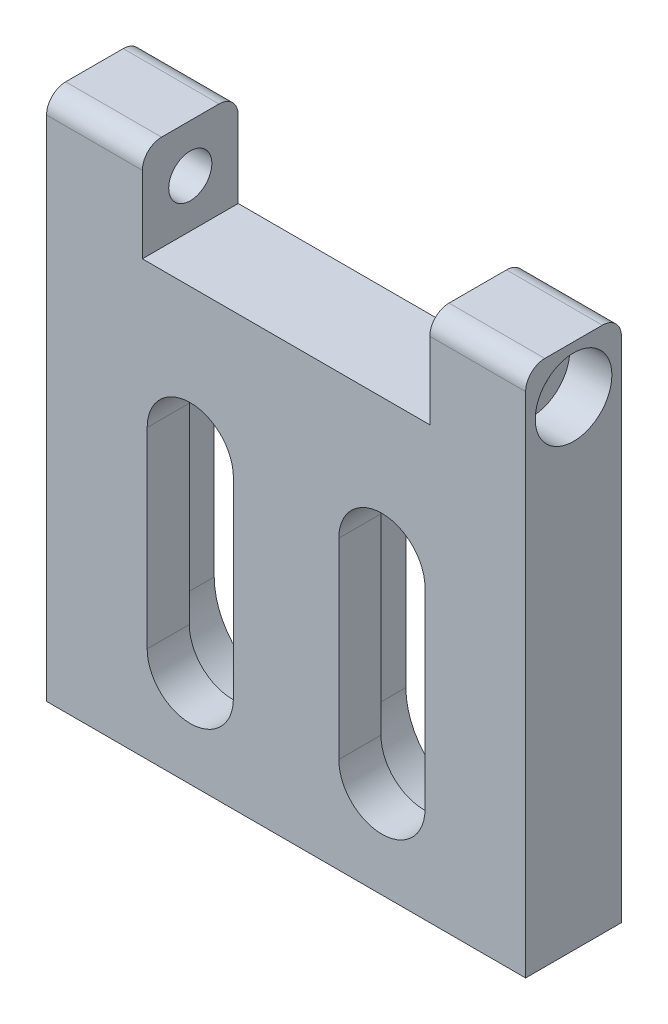
ISO-10303-21;
HEADER;
FILE_DESCRIPTION(('STEP AP214'),'2;1');
FILE_NAME('part.step','',(''),(''),'','','');
FILE_SCHEMA(('AUTOMOTIVE_DESIGN { 1 0 10303 214 1 1 1 1 }'));
ENDSEC;
DATA;
#1=APPLICATION_CONTEXT('core data for automotive mechanical design processes');
#2=APPLICATION_PROTOCOL_DEFINITION('international standard','automotive_design',2000,#1);
#3=PRODUCT_CONTEXT('',#1,'mechanical');
#4=PRODUCT('Part','Part','',(#3));
#5=PRODUCT_RELATED_PRODUCT_CATEGORY('part','',(#4));
#6=PRODUCT_DEFINITION_FORMATION('','',#4);
#7=PRODUCT_DEFINITION_CONTEXT('part definition',#1,'design');
#8=PRODUCT_DEFINITION('design','',#6,#7);
#9=PRODUCT_DEFINITION_SHAPE('','',#8);
#10=(LENGTH_UNIT() NAMED_UNIT(*) SI_UNIT(.MILLI.,.METRE.));
#11=(NAMED_UNIT(*) PLANE_ANGLE_UNIT() SI_UNIT($,.RADIAN.));
#12=(NAMED_UNIT(*) SI_UNIT($,.STERADIAN.) SOLID_ANGLE_UNIT());
#13=UNCERTAINTY_MEASURE_WITH_UNIT(LENGTH_MEASURE(1.E-05),#10,'distance_accuracy_value','');
#14=(GEOMETRIC_REPRESENTATION_CONTEXT(3) GLOBAL_UNCERTAINTY_ASSIGNED_CONTEXT((#13)) GLOBAL_UNIT_ASSIGNED_CONTEXT((#10,
#11,#12)) REPRESENTATION_CONTEXT('',''));
#15=CARTESIAN_POINT('',(0.,0.,0.));
#16=DIRECTION('',(0.,0.,1.));
#17=DIRECTION('',(1.,0.,0.));
#18=AXIS2_PLACEMENT_3D('',#15,#16,#17);
#19=CARTESIAN_POINT('',(10.,2.5,10.));
#20=DIRECTION('',(0.,0.,-1.));
#21=DIRECTION('',(-1.,0.,0.));
#22=AXIS2_PLACEMENT_3D('',#19,#20,#21);
#23=CYLINDRICAL_SURFACE('',#22,4.49999999999997);
#24=DIRECTION('',(0.,0.,-1.));
#25=VECTOR('',#24,1.);
#26=CARTESIAN_POINT('',(5.50000000000003,2.50000000000001,10.));
#27=LINE('',#26,#25);
#28=CARTESIAN_POINT('',(5.50000000000003,2.50000000000001,10.));
#29=VERTEX_POINT('',#28);
#30=CARTESIAN_POINT('',(5.50000000000003,2.50000000000001,5.6));
#31=VERTEX_POINT('',#30);
#32=EDGE_CURVE('E432',#29,#31,#27,.T.);
#33=ORIENTED_EDGE('',*,*,#32,.T.);
#34=CARTESIAN_POINT('',(10.,2.5,5.6));
#35=DIRECTION('',(0.,0.,-1.));
#36=DIRECTION('',(-1.,0.,0.));
#37=AXIS2_PLACEMENT_3D('',#34,#35,#36);
#38=CIRCLE('',#37,4.49999999999997);
#39=CARTESIAN_POINT('',(14.5,2.50000000000001,5.6));
#40=VERTEX_POINT('',#39);
#41=EDGE_CURVE('E331',#31,#40,#38,.T.);
#42=ORIENTED_EDGE('',*,*,#41,.T.);
#43=DIRECTION('',(0.,0.,-1.));
#44=VECTOR('',#43,1.);
#45=CARTESIAN_POINT('',(14.5,2.50000000000001,10.));
#46=LINE('',#45,#44);
#47=CARTESIAN_POINT('',(14.5,2.50000000000001,10.));
#48=VERTEX_POINT('',#47);
#49=EDGE_CURVE('E420',#48,#40,#46,.T.);
#50=ORIENTED_EDGE('',*,*,#49,.F.);
#51=CARTESIAN_POINT('',(10.,2.5,10.));
#52=DIRECTION('',(0.,0.,1.));
#53=DIRECTION('',(-1.,0.,0.));
#54=AXIS2_PLACEMENT_3D('',#51,#52,#53);
#55=CIRCLE('',#54,4.49999999999997);
#56=EDGE_CURVE('E397',#48,#29,#55,.T.);
#57=ORIENTED_EDGE('',*,*,#56,.T.);
#58=EDGE_LOOP('',(#33,#42,#50,#57));
#59=FACE_BOUND('',#58,.T.);
#60=ADVANCED_FACE('F38',(#59),#23,.F.);
#61=CARTESIAN_POINT('',(5.50000000000003,2.50000000000001,10.));
#62=DIRECTION('',(1.,0.,0.));
#63=DIRECTION('',(0.,1.,0.));
#64=AXIS2_PLACEMENT_3D('',#61,#62,#63);
#65=PLANE('',#64);
#66=DIRECTION('',(0.,0.,-1.));
#67=VECTOR('',#66,1.);
#68=CARTESIAN_POINT('',(5.50000000000004,-17.5,10.));
#69=LINE('',#68,#67);
#70=CARTESIAN_POINT('',(5.50000000000004,-17.5,10.));
#71=VERTEX_POINT('',#70);
#72=CARTESIAN_POINT('',(5.50000000000005,-17.5,5.6));
#73=VERTEX_POINT('',#72);
#74=EDGE_CURVE('E428',#71,#73,#69,.T.);
#75=ORIENTED_EDGE('',*,*,#74,.T.);
#76=DIRECTION('',(0.,1.,0.));
#77=VECTOR('',#76,1.);
#78=CARTESIAN_POINT('',(5.50000000000003,2.50000000000001,5.6));
#79=LINE('',#78,#77);
#80=EDGE_CURVE('E327',#73,#31,#79,.T.);
#81=ORIENTED_EDGE('',*,*,#80,.T.);
#82=ORIENTED_EDGE('',*,*,#32,.F.);
#83=DIRECTION('',(0.,-1.,0.));
#84=VECTOR('',#83,1.);
#85=CARTESIAN_POINT('',(5.50000000000003,2.50000000000001,10.));
#86=LINE('',#85,#84);
#87=EDGE_CURVE('E410',#29,#71,#86,.T.);
#88=ORIENTED_EDGE('',*,*,#87,.T.);
#89=EDGE_LOOP('',(#75,#81,#82,#88));
#90=FACE_BOUND('',#89,.T.);
#91=ADVANCED_FACE('F624',(#90),#65,.T.);
#92=CARTESIAN_POINT('',(10.,-17.5,10.));
#93=DIRECTION('',(0.,0.,-1.));
#94=DIRECTION('',(-1.,0.,0.));
#95=AXIS2_PLACEMENT_3D('',#92,#93,#94);
#96=CYLINDRICAL_SURFACE('',#95,4.49999999999997);
#97=DIRECTION('',(0.,0.,-1.));
#98=VECTOR('',#97,1.);
#99=CARTESIAN_POINT('',(14.5,-17.5,10.));
#100=LINE('',#99,#98);
#101=CARTESIAN_POINT('',(14.5,-17.5,10.));
#102=VERTEX_POINT('',#101);
#103=CARTESIAN_POINT('',(14.5,-17.5,5.6));
#104=VERTEX_POINT('',#103);
#105=EDGE_CURVE('E424',#102,#104,#100,.T.);
#106=ORIENTED_EDGE('',*,*,#105,.T.);
#107=CARTESIAN_POINT('',(10.,-17.5,5.6));
#108=DIRECTION('',(0.,0.,-1.));
#109=DIRECTION('',(-1.,0.,0.));
#110=AXIS2_PLACEMENT_3D('',#107,#108,#109);
#111=CIRCLE('',#110,4.49999999999997);
#112=EDGE_CURVE('E275',#104,#73,#111,.T.);
#113=ORIENTED_EDGE('',*,*,#112,.T.);
#114=ORIENTED_EDGE('',*,*,#74,.F.);
#115=CARTESIAN_POINT('',(10.,-17.5,10.));
#116=DIRECTION('',(0.,0.,1.));
#117=DIRECTION('',(-1.,0.,0.));
#118=AXIS2_PLACEMENT_3D('',#115,#116,#117);
#119=CIRCLE('',#118,4.49999999999997);
#120=EDGE_CURVE('E413',#71,#102,#119,.T.);
#121=ORIENTED_EDGE('',*,*,#120,.T.);
#122=EDGE_LOOP('',(#106,#113,#114,#121));
#123=FACE_BOUND('',#122,.T.);
#124=ADVANCED_FACE('F630',(#123),#96,.F.);
#125=CARTESIAN_POINT('',(14.5,2.50000000000001,10.));
#126=DIRECTION('',(-1.,0.,0.));
#127=DIRECTION('',(0.,-1.,0.));
#128=AXIS2_PLACEMENT_3D('',#125,#126,#127);
#129=PLANE('',#128);
#130=ORIENTED_EDGE('',*,*,#49,.T.);
#131=DIRECTION('',(0.,-1.,0.));
#132=VECTOR('',#131,1.);
#133=CARTESIAN_POINT('',(14.5,2.50000000000001,5.6));
#134=LINE('',#133,#132);
#135=EDGE_CURVE('E499',#40,#104,#134,.T.);
#136=ORIENTED_EDGE('',*,*,#135,.T.);
#137=ORIENTED_EDGE('',*,*,#105,.F.);
#138=DIRECTION('',(0.,1.,0.));
#139=VECTOR('',#138,1.);
#140=CARTESIAN_POINT('',(14.5,2.50000000000001,10.));
#141=LINE('',#140,#139);
#142=EDGE_CURVE('E417',#102,#48,#141,.T.);
#143=ORIENTED_EDGE('',*,*,#142,.T.);
#144=EDGE_LOOP('',(#130,#136,#137,#143));
#145=FACE_BOUND('',#144,.T.);
#146=ADVANCED_FACE('F725',(#145),#129,.T.);
#147=CARTESIAN_POINT('',(-25.,27.5,10.));
#148=DIRECTION('',(0.,-1.,0.));
#149=DIRECTION('',(0.,0.,-1.));
#150=AXIS2_PLACEMENT_3D('',#147,#148,#149);
#151=PLANE('',#150);
#152=DIRECTION('',(0.,0.,-1.));
#153=VECTOR('',#152,1.);
#154=CARTESIAN_POINT('',(25.,27.5,10.));
#155=LINE('',#154,#153);
#156=CARTESIAN_POINT('',(25.,27.5,8.));
#157=VERTEX_POINT('',#156);
#158=CARTESIAN_POINT('',(25.,27.5,2.));
#159=VERTEX_POINT('',#158);
#160=EDGE_CURVE('E496',#157,#159,#155,.T.);
#161=ORIENTED_EDGE('',*,*,#160,.T.);
#162=DIRECTION('',(-1.,0.,0.));
#163=VECTOR('',#162,1.);
#164=CARTESIAN_POINT('',(-25.,27.5,2.));
#165=LINE('',#164,#163);
#166=CARTESIAN_POINT('',(15.,27.5,2.));
#167=VERTEX_POINT('',#166);
#168=EDGE_CURVE('E547',#159,#167,#165,.T.);
#169=ORIENTED_EDGE('',*,*,#168,.T.);
#170=DIRECTION('',(0.,0.,-1.));
#171=VECTOR('',#170,1.);
#172=CARTESIAN_POINT('',(15.,27.5,10.));
#173=LINE('',#172,#171);
#174=CARTESIAN_POINT('',(15.,27.5,8.));
#175=VERTEX_POINT('',#174);
#176=EDGE_CURVE('E393',#175,#167,#173,.T.);
#177=ORIENTED_EDGE('',*,*,#176,.F.);
#178=DIRECTION('',(-1.,0.,0.));
#179=VECTOR('',#178,1.);
#180=CARTESIAN_POINT('',(25.,27.5,8.));
#181=LINE('',#180,#179);
#182=EDGE_CURVE('E59',#175,#157,#181,.F.);
#183=ORIENTED_EDGE('',*,*,#182,.T.);
#184=EDGE_LOOP('',(#161,#169,#177,#183));
#185=FACE_BOUND('',#184,.T.);
#186=ADVANCED_FACE('F572',(#185),#151,.F.);
#187=CARTESIAN_POINT('',(0.,0.,10.));
#188=DIRECTION('',(0.,0.,1.));
#189=DIRECTION('',(1.,0.,0.));
#190=AXIS2_PLACEMENT_3D('',#187,#188,#189);
#191=PLANE('',#190);
#192=DIRECTION('',(0.,1.,0.));
#193=VECTOR('',#192,1.);
#194=CARTESIAN_POINT('',(-15.,27.5,10.));
#195=LINE('',#194,#193);
#196=CARTESIAN_POINT('',(-15.,17.5,10.));
#197=VERTEX_POINT('',#196);
#198=CARTESIAN_POINT('',(-15.,25.5,10.));
#199=VERTEX_POINT('',#198);
#200=EDGE_CURVE('E378',#197,#199,#195,.T.);
#201=ORIENTED_EDGE('',*,*,#200,.T.);
#202=DIRECTION('',(-1.,0.,0.));
#203=VECTOR('',#202,1.);
#204=CARTESIAN_POINT('',(-25.,25.5,10.));
#205=LINE('',#204,#203);
#206=CARTESIAN_POINT('',(-25.,25.5,10.));
#207=VERTEX_POINT('',#206);
#208=EDGE_CURVE('E541',#199,#207,#205,.T.);
#209=ORIENTED_EDGE('',*,*,#208,.T.);
#210=DIRECTION('',(0.,-1.,0.));
#211=VECTOR('',#210,1.);
#212=CARTESIAN_POINT('',(-25.,27.5,10.));
#213=LINE('',#212,#211);
#214=CARTESIAN_POINT('',(-25.,-27.5,10.));
#215=VERTEX_POINT('',#214);
#216=EDGE_CURVE('E470',#207,#215,#213,.T.);
#217=ORIENTED_EDGE('',*,*,#216,.T.);
#218=DIRECTION('',(1.,0.,0.));
#219=VECTOR('',#218,1.);
#220=CARTESIAN_POINT('',(-25.,-27.5,10.));
#221=LINE('',#220,#219);
#222=CARTESIAN_POINT('',(25.,-27.5,10.));
#223=VERTEX_POINT('',#222);
#224=EDGE_CURVE('E474',#215,#223,#221,.T.);
#225=ORIENTED_EDGE('',*,*,#224,.T.);
#226=DIRECTION('',(0.,1.,0.));
#227=VECTOR('',#226,1.);
#228=CARTESIAN_POINT('',(25.,27.5,10.));
#229=LINE('',#228,#227);
#230=CARTESIAN_POINT('',(25.,25.5,10.));
#231=VERTEX_POINT('',#230);
#232=EDGE_CURVE('E466',#223,#231,#229,.T.);
#233=ORIENTED_EDGE('',*,*,#232,.T.);
#234=DIRECTION('',(-1.,0.,0.));
#235=VECTOR('',#234,1.);
#236=CARTESIAN_POINT('',(15.,25.5,10.));
#237=LINE('',#236,#235);
#238=CARTESIAN_POINT('',(15.,25.5,10.));
#239=VERTEX_POINT('',#238);
#240=EDGE_CURVE('E537',#231,#239,#237,.T.);
#241=ORIENTED_EDGE('',*,*,#240,.T.);
#242=DIRECTION('',(0.,-1.,0.));
#243=VECTOR('',#242,1.);
#244=CARTESIAN_POINT('',(15.,27.5,10.));
#245=LINE('',#244,#243);
#246=CARTESIAN_POINT('',(15.,17.5,10.));
#247=VERTEX_POINT('',#246);
#248=EDGE_CURVE('E370',#239,#247,#245,.T.);
#249=ORIENTED_EDGE('',*,*,#248,.T.);
#250=DIRECTION('',(-1.,0.,0.));
#251=VECTOR('',#250,1.);
#252=CARTESIAN_POINT('',(15.,17.5,10.));
#253=LINE('',#252,#251);
#254=EDGE_CURVE('E373',#247,#197,#253,.T.);
#255=ORIENTED_EDGE('',*,*,#254,.T.);
#256=EDGE_LOOP('',(#201,#209,#217,#225,#233,#241,#249,#255));
#257=FACE_BOUND('',#256,.T.);
#258=DIRECTION('',(0.,-1.,0.));
#259=VECTOR('',#258,1.);
#260=CARTESIAN_POINT('',(-14.5,2.5,10.));
#261=LINE('',#260,#259);
#262=CARTESIAN_POINT('',(-14.5,2.5,10.));
#263=VERTEX_POINT('',#262);
#264=CARTESIAN_POINT('',(-14.5,-17.5,10.));
#265=VERTEX_POINT('',#264);
#266=EDGE_CURVE('E439',#263,#265,#261,.T.);
#267=ORIENTED_EDGE('',*,*,#266,.F.);
#268=CARTESIAN_POINT('',(-10.,2.5,10.));
#269=DIRECTION('',(0.,0.,1.));
#270=DIRECTION('',(1.,0.,0.));
#271=AXIS2_PLACEMENT_3D('',#268,#269,#270);
#272=CIRCLE('',#271,4.49999999999997);
#273=CARTESIAN_POINT('',(-5.50000000000002,2.50000000000001,10.));
#274=VERTEX_POINT('',#273);
#275=EDGE_CURVE('E436',#274,#263,#272,.T.);
#276=ORIENTED_EDGE('',*,*,#275,.F.);
#277=DIRECTION('',(0.,1.,0.));
#278=VECTOR('',#277,1.);
#279=CARTESIAN_POINT('',(-5.50000000000002,2.50000000000001,10.));
#280=LINE('',#279,#278);
#281=CARTESIAN_POINT('',(-5.50000000000002,-17.5,10.));
#282=VERTEX_POINT('',#281);
#283=EDGE_CURVE('E446',#282,#274,#280,.T.);
#284=ORIENTED_EDGE('',*,*,#283,.F.);
#285=CARTESIAN_POINT('',(-9.99999999999999,-17.5,10.));
#286=DIRECTION('',(0.,0.,1.));
#287=DIRECTION('',(1.,0.,0.));
#288=AXIS2_PLACEMENT_3D('',#285,#286,#287);
#289=CIRCLE('',#288,4.49999999999997);
#290=EDGE_CURVE('E442',#265,#282,#289,.T.);
#291=ORIENTED_EDGE('',*,*,#290,.F.);
#292=EDGE_LOOP('',(#267,#276,#284,#291));
#293=FACE_BOUND('',#292,.T.);
#294=ORIENTED_EDGE('',*,*,#87,.F.);
#295=ORIENTED_EDGE('',*,*,#56,.F.);
#296=ORIENTED_EDGE('',*,*,#142,.F.);
#297=ORIENTED_EDGE('',*,*,#120,.F.);
#298=EDGE_LOOP('',(#294,#295,#296,#297));
#299=FACE_BOUND('',#298,.T.);
#300=ADVANCED_FACE('F564',(#257,#293,#299),#191,.T.);
#301=CARTESIAN_POINT('',(0.,0.,0.));
#302=DIRECTION('',(0.,0.,1.));
#303=DIRECTION('',(1.,0.,0.));
#304=AXIS2_PLACEMENT_3D('',#301,#302,#303);
#305=PLANE('',#304);
#306=DIRECTION('',(0.,-1.,0.));
#307=VECTOR('',#306,1.);
#308=CARTESIAN_POINT('',(17.5,2.5,0.));
#309=LINE('',#308,#307);
#310=CARTESIAN_POINT('',(17.5,2.5,0.));
#311=VERTEX_POINT('',#310);
#312=CARTESIAN_POINT('',(17.5,-17.5,0.));
#313=VERTEX_POINT('',#312);
#314=EDGE_CURVE('E265',#311,#313,#309,.T.);
#315=ORIENTED_EDGE('',*,*,#314,.F.);
#316=CARTESIAN_POINT('',(10.,2.50000000000001,0.));
#317=DIRECTION('',(0.,0.,-1.));
#318=DIRECTION('',(-1.,0.,0.));
#319=AXIS2_PLACEMENT_3D('',#316,#317,#318);
#320=CIRCLE('',#319,7.5);
#321=CARTESIAN_POINT('',(2.50000000000001,2.50000000000001,0.));
#322=VERTEX_POINT('',#321);
#323=EDGE_CURVE('E231',#322,#311,#320,.T.);
#324=ORIENTED_EDGE('',*,*,#323,.F.);
#325=DIRECTION('',(0.,1.,0.));
#326=VECTOR('',#325,1.);
#327=CARTESIAN_POINT('',(2.50000000000001,2.50000000000001,0.));
#328=LINE('',#327,#326);
#329=CARTESIAN_POINT('',(2.50000000000001,-17.5,0.));
#330=VERTEX_POINT('',#329);
#331=EDGE_CURVE('E251',#330,#322,#328,.T.);
#332=ORIENTED_EDGE('',*,*,#331,.F.);
#333=CARTESIAN_POINT('',(10.,-17.5,0.));
#334=DIRECTION('',(0.,0.,-1.));
#335=DIRECTION('',(-1.,0.,0.));
#336=AXIS2_PLACEMENT_3D('',#333,#334,#335);
#337=CIRCLE('',#336,7.5);
#338=EDGE_CURVE('E256',#313,#330,#337,.T.);
#339=ORIENTED_EDGE('',*,*,#338,.F.);
#340=EDGE_LOOP('',(#315,#324,#332,#339));
#341=FACE_BOUND('',#340,.T.);
#342=DIRECTION('',(0.,-1.,0.));
#343=VECTOR('',#342,1.);
#344=CARTESIAN_POINT('',(-2.50000000000001,2.50000000000001,0.));
#345=LINE('',#344,#343);
#346=CARTESIAN_POINT('',(-2.50000000000001,2.50000000000001,0.));
#347=VERTEX_POINT('',#346);
#348=CARTESIAN_POINT('',(-2.50000000000001,-17.5,0.));
#349=VERTEX_POINT('',#348);
#350=EDGE_CURVE('E302',#347,#349,#345,.T.);
#351=ORIENTED_EDGE('',*,*,#350,.F.);
#352=CARTESIAN_POINT('',(-10.,2.50000000000001,0.));
#353=DIRECTION('',(0.,0.,-1.));
#354=DIRECTION('',(1.,0.,0.));
#355=AXIS2_PLACEMENT_3D('',#352,#353,#354);
#356=CIRCLE('',#355,7.5);
#357=CARTESIAN_POINT('',(-17.5,2.5,0.));
#358=VERTEX_POINT('',#357);
#359=EDGE_CURVE('E299',#358,#347,#356,.T.);
#360=ORIENTED_EDGE('',*,*,#359,.F.);
#361=DIRECTION('',(0.,1.,0.));
#362=VECTOR('',#361,1.);
#363=CARTESIAN_POINT('',(-17.5,2.5,0.));
#364=LINE('',#363,#362);
#365=CARTESIAN_POINT('',(-17.5,-17.5,0.));
#366=VERTEX_POINT('',#365);
#367=EDGE_CURVE('E286',#366,#358,#364,.T.);
#368=ORIENTED_EDGE('',*,*,#367,.F.);
#369=CARTESIAN_POINT('',(-10.,-17.5,0.));
#370=DIRECTION('',(0.,0.,-1.));
#371=DIRECTION('',(1.,0.,0.));
#372=AXIS2_PLACEMENT_3D('',#369,#370,#371);
#373=CIRCLE('',#372,7.5);
#374=EDGE_CURVE('E306',#349,#366,#373,.T.);
#375=ORIENTED_EDGE('',*,*,#374,.F.);
#376=EDGE_LOOP('',(#351,#360,#368,#375));
#377=FACE_BOUND('',#376,.T.);
#378=DIRECTION('',(0.,-1.,0.));
#379=VECTOR('',#378,1.);
#380=CARTESIAN_POINT('',(-25.,27.5,0.));
#381=LINE('',#380,#379);
#382=CARTESIAN_POINT('',(-25.,25.5,0.));
#383=VERTEX_POINT('',#382);
#384=CARTESIAN_POINT('',(-25.,-27.5,0.));
#385=VERTEX_POINT('',#384);
#386=EDGE_CURVE('E480',#383,#385,#381,.T.);
#387=ORIENTED_EDGE('',*,*,#386,.F.);
#388=DIRECTION('',(-1.,0.,0.));
#389=VECTOR('',#388,1.);
#390=CARTESIAN_POINT('',(0.,25.5,0.));
#391=LINE('',#390,#389);
#392=CARTESIAN_POINT('',(-15.,25.5,0.));
#393=VERTEX_POINT('',#392);
#394=EDGE_CURVE('E528',#383,#393,#391,.F.);
#395=ORIENTED_EDGE('',*,*,#394,.T.);
#396=DIRECTION('',(0.,1.,0.));
#397=VECTOR('',#396,1.);
#398=CARTESIAN_POINT('',(-15.,27.5,0.));
#399=LINE('',#398,#397);
#400=CARTESIAN_POINT('',(-15.,17.5,0.));
#401=VERTEX_POINT('',#400);
#402=EDGE_CURVE('E374',#401,#393,#399,.T.);
#403=ORIENTED_EDGE('',*,*,#402,.F.);
#404=DIRECTION('',(-1.,0.,0.));
#405=VECTOR('',#404,1.);
#406=CARTESIAN_POINT('',(15.,17.5,0.));
#407=LINE('',#406,#405);
#408=CARTESIAN_POINT('',(15.,17.5,0.));
#409=VERTEX_POINT('',#408);
#410=EDGE_CURVE('E386',#409,#401,#407,.T.);
#411=ORIENTED_EDGE('',*,*,#410,.F.);
#412=DIRECTION('',(0.,-1.,0.));
#413=VECTOR('',#412,1.);
#414=CARTESIAN_POINT('',(15.,27.5,0.));
#415=LINE('',#414,#413);
#416=CARTESIAN_POINT('',(15.,25.5,0.));
#417=VERTEX_POINT('',#416);
#418=EDGE_CURVE('E383',#417,#409,#415,.T.);
#419=ORIENTED_EDGE('',*,*,#418,.F.);
#420=DIRECTION('',(-1.,0.,0.));
#421=VECTOR('',#420,1.);
#422=CARTESIAN_POINT('',(0.,25.5,0.));
#423=LINE('',#422,#421);
#424=CARTESIAN_POINT('',(25.,25.5,0.));
#425=VERTEX_POINT('',#424);
#426=EDGE_CURVE('E525',#417,#425,#423,.F.);
#427=ORIENTED_EDGE('',*,*,#426,.T.);
#428=DIRECTION('',(0.,1.,0.));
#429=VECTOR('',#428,1.);
#430=CARTESIAN_POINT('',(25.,27.5,0.));
#431=LINE('',#430,#429);
#432=CARTESIAN_POINT('',(25.,-27.5,0.));
#433=VERTEX_POINT('',#432);
#434=EDGE_CURVE('E465',#433,#425,#431,.T.);
#435=ORIENTED_EDGE('',*,*,#434,.F.);
#436=DIRECTION('',(1.,0.,0.));
#437=VECTOR('',#436,1.);
#438=CARTESIAN_POINT('',(-25.,-27.5,0.));
#439=LINE('',#438,#437);
#440=EDGE_CURVE('E471',#385,#433,#439,.T.);
#441=ORIENTED_EDGE('',*,*,#440,.F.);
#442=EDGE_LOOP('',(#387,#395,#403,#411,#419,#427,#435,#441));
#443=FACE_BOUND('',#442,.T.);
#444=ADVANCED_FACE('F581',(#341,#377,#443),#305,.F.);
#445=CARTESIAN_POINT('',(25.,27.5,10.));
#446=DIRECTION('',(-1.,0.,0.));
#447=DIRECTION('',(0.,-1.,0.));
#448=AXIS2_PLACEMENT_3D('',#445,#446,#447);
#449=PLANE('',#448);
#450=CARTESIAN_POINT('',(25.,22.5,5.));
#451=DIRECTION('',(1.,0.,0.));
#452=DIRECTION('',(0.,0.,-1.));
#453=AXIS2_PLACEMENT_3D('',#450,#451,#452);
#454=CIRCLE('',#453,3.99999999999999);
#455=CARTESIAN_POINT('',(25.,22.5,1.00000000000001));
#456=VERTEX_POINT('',#455);
#457=EDGE_CURVE('E357',#456,#456,#454,.T.);
#458=ORIENTED_EDGE('',*,*,#457,.F.);
#459=EDGE_LOOP('',(#458));
#460=FACE_BOUND('',#459,.T.);
#461=ORIENTED_EDGE('',*,*,#434,.T.);
#462=CARTESIAN_POINT('',(25.,25.5,2.));
#463=DIRECTION('',(-1.,0.,0.));
#464=DIRECTION('',(0.,-1.,0.));
#465=AXIS2_PLACEMENT_3D('',#462,#463,#464);
#466=CIRCLE('',#465,2.);
#467=EDGE_CURVE('E11',#425,#159,#466,.F.);
#468=ORIENTED_EDGE('',*,*,#467,.T.);
#469=ORIENTED_EDGE('',*,*,#160,.F.);
#470=CARTESIAN_POINT('',(25.,25.5,8.));
#471=DIRECTION('',(-1.,0.,0.));
#472=DIRECTION('',(0.,-1.,0.));
#473=AXIS2_PLACEMENT_3D('',#470,#471,#472);
#474=CIRCLE('',#473,2.);
#475=EDGE_CURVE('E47',#157,#231,#474,.F.);
#476=ORIENTED_EDGE('',*,*,#475,.T.);
#477=ORIENTED_EDGE('',*,*,#232,.F.);
#478=DIRECTION('',(0.,0.,-1.));
#479=VECTOR('',#478,1.);
#480=CARTESIAN_POINT('',(25.,-27.5,10.));
#481=LINE('',#480,#479);
#482=EDGE_CURVE('E477',#223,#433,#481,.T.);
#483=ORIENTED_EDGE('',*,*,#482,.T.);
#484=EDGE_LOOP('',(#461,#468,#469,#476,#477,#483));
#485=FACE_BOUND('',#484,.T.);
#486=ADVANCED_FACE('F560',(#460,#485),#449,.F.);
#487=DIRECTION('',(0.,0.,-1.));
#488=VECTOR('',#487,1.);
#489=CARTESIAN_POINT('',(-15.,27.5,10.));
#490=LINE('',#489,#488);
#491=CARTESIAN_POINT('',(-15.,27.5,8.));
#492=VERTEX_POINT('',#491);
#493=CARTESIAN_POINT('',(-15.,27.5,2.));
#494=VERTEX_POINT('',#493);
#495=EDGE_CURVE('E398',#492,#494,#490,.T.);
#496=ORIENTED_EDGE('',*,*,#495,.T.);
#497=DIRECTION('',(-1.,0.,0.));
#498=VECTOR('',#497,1.);
#499=CARTESIAN_POINT('',(-25.,27.5,2.));
#500=LINE('',#499,#498);
#501=CARTESIAN_POINT('',(-25.,27.5,2.));
#502=VERTEX_POINT('',#501);
#503=EDGE_CURVE('E515',#494,#502,#500,.T.);
#504=ORIENTED_EDGE('',*,*,#503,.T.);
#505=DIRECTION('',(0.,0.,-1.));
#506=VECTOR('',#505,1.);
#507=CARTESIAN_POINT('',(-25.,27.5,10.));
#508=LINE('',#507,#506);
#509=CARTESIAN_POINT('',(-25.,27.5,8.));
#510=VERTEX_POINT('',#509);
#511=EDGE_CURVE('E492',#510,#502,#508,.T.);
#512=ORIENTED_EDGE('',*,*,#511,.F.);
#513=DIRECTION('',(-1.,0.,0.));
#514=VECTOR('',#513,1.);
#515=CARTESIAN_POINT('',(-15.,27.5,8.));
#516=LINE('',#515,#514);
#517=EDGE_CURVE('E512',#510,#492,#516,.F.);
#518=ORIENTED_EDGE('',*,*,#517,.T.);
#519=EDGE_LOOP('',(#496,#504,#512,#518));
#520=FACE_BOUND('',#519,.T.);
#521=ADVANCED_FACE('F600',(#520),#151,.F.);
#522=CARTESIAN_POINT('',(-25.,27.5,10.));
#523=DIRECTION('',(1.,0.,0.));
#524=DIRECTION('',(0.,1.,0.));
#525=AXIS2_PLACEMENT_3D('',#522,#523,#524);
#526=PLANE('',#525);
#527=CARTESIAN_POINT('',(-25.,22.5,5.));
#528=DIRECTION('',(-1.,0.,0.));
#529=DIRECTION('',(0.,0.,1.));
#530=AXIS2_PLACEMENT_3D('',#527,#528,#529);
#531=CIRCLE('',#530,3.99999999999999);
#532=CARTESIAN_POINT('',(-25.,22.5,8.99999999999999));
#533=VERTEX_POINT('',#532);
#534=EDGE_CURVE('E344',#533,#533,#531,.T.);
#535=ORIENTED_EDGE('',*,*,#534,.F.);
#536=EDGE_LOOP('',(#535));
#537=FACE_BOUND('',#536,.T.);
#538=ORIENTED_EDGE('',*,*,#511,.T.);
#539=CARTESIAN_POINT('',(-25.,25.5,2.));
#540=DIRECTION('',(1.,0.,0.));
#541=DIRECTION('',(0.,1.,0.));
#542=AXIS2_PLACEMENT_3D('',#539,#540,#541);
#543=CIRCLE('',#542,2.);
#544=EDGE_CURVE('E522',#502,#383,#543,.F.);
#545=ORIENTED_EDGE('',*,*,#544,.T.);
#546=ORIENTED_EDGE('',*,*,#386,.T.);
#547=DIRECTION('',(0.,0.,-1.));
#548=VECTOR('',#547,1.);
#549=CARTESIAN_POINT('',(-25.,-27.5,10.));
#550=LINE('',#549,#548);
#551=EDGE_CURVE('E488',#215,#385,#550,.T.);
#552=ORIENTED_EDGE('',*,*,#551,.F.);
#553=ORIENTED_EDGE('',*,*,#216,.F.);
#554=CARTESIAN_POINT('',(-25.,25.5,8.));
#555=DIRECTION('',(1.,0.,0.));
#556=DIRECTION('',(0.,1.,0.));
#557=AXIS2_PLACEMENT_3D('',#554,#555,#556);
#558=CIRCLE('',#557,2.);
#559=EDGE_CURVE('E519',#207,#510,#558,.F.);
#560=ORIENTED_EDGE('',*,*,#559,.T.);
#561=EDGE_LOOP('',(#538,#545,#546,#552,#553,#560));
#562=FACE_BOUND('',#561,.T.);
#563=ADVANCED_FACE('F597',(#537,#562),#526,.F.);
#564=CARTESIAN_POINT('',(-25.,-27.5,10.));
#565=DIRECTION('',(0.,1.,0.));
#566=DIRECTION('',(0.,0.,1.));
#567=AXIS2_PLACEMENT_3D('',#564,#565,#566);
#568=PLANE('',#567);
#569=ORIENTED_EDGE('',*,*,#440,.T.);
#570=ORIENTED_EDGE('',*,*,#482,.F.);
#571=ORIENTED_EDGE('',*,*,#224,.F.);
#572=ORIENTED_EDGE('',*,*,#551,.T.);
#573=EDGE_LOOP('',(#569,#570,#571,#572));
#574=FACE_BOUND('',#573,.T.);
#575=ADVANCED_FACE('F609',(#574),#568,.F.);
#576=CARTESIAN_POINT('',(-10.,2.5,10.));
#577=DIRECTION('',(0.,0.,-1.));
#578=DIRECTION('',(-1.,0.,0.));
#579=AXIS2_PLACEMENT_3D('',#576,#577,#578);
#580=CYLINDRICAL_SURFACE('',#579,4.49999999999997);
#581=CARTESIAN_POINT('',(-10.,2.5,5.6));
#582=DIRECTION('',(0.,0.,1.));
#583=DIRECTION('',(1.,0.,0.));
#584=AXIS2_PLACEMENT_3D('',#581,#582,#583);
#585=CIRCLE('',#584,4.49999999999997);
#586=CARTESIAN_POINT('',(-5.50000000000002,2.50000000000001,5.6));
#587=VERTEX_POINT('',#586);
#588=CARTESIAN_POINT('',(-14.5,2.5,5.6));
#589=VERTEX_POINT('',#588);
#590=EDGE_CURVE('E341',#587,#589,#585,.T.);
#591=ORIENTED_EDGE('',*,*,#590,.F.);
#592=DIRECTION('',(0.,0.,-1.));
#593=VECTOR('',#592,1.);
#594=CARTESIAN_POINT('',(-5.50000000000002,2.50000000000001,10.));
#595=LINE('',#594,#593);
#596=EDGE_CURVE('E449',#274,#587,#595,.T.);
#597=ORIENTED_EDGE('',*,*,#596,.F.);
#598=ORIENTED_EDGE('',*,*,#275,.T.);
#599=DIRECTION('',(0.,0.,-1.));
#600=VECTOR('',#599,1.);
#601=CARTESIAN_POINT('',(-14.5,2.5,10.));
#602=LINE('',#601,#600);
#603=EDGE_CURVE('E461',#263,#589,#602,.T.);
#604=ORIENTED_EDGE('',*,*,#603,.T.);
#605=EDGE_LOOP('',(#591,#597,#598,#604));
#606=FACE_BOUND('',#605,.T.);
#607=ADVANCED_FACE('F611',(#606),#580,.F.);
#608=CARTESIAN_POINT('',(-14.5,2.5,10.));
#609=DIRECTION('',(1.,0.,0.));
#610=DIRECTION('',(0.,1.,0.));
#611=AXIS2_PLACEMENT_3D('',#608,#609,#610);
#612=PLANE('',#611);
#613=DIRECTION('',(0.,-1.,0.));
#614=VECTOR('',#613,1.);
#615=CARTESIAN_POINT('',(-14.5,2.5,5.6));
#616=LINE('',#615,#614);
#617=CARTESIAN_POINT('',(-14.5,-17.5,5.6));
#618=VERTEX_POINT('',#617);
#619=EDGE_CURVE('E338',#589,#618,#616,.T.);
#620=ORIENTED_EDGE('',*,*,#619,.F.);
#621=ORIENTED_EDGE('',*,*,#603,.F.);
#622=ORIENTED_EDGE('',*,*,#266,.T.);
#623=DIRECTION('',(0.,0.,-1.));
#624=VECTOR('',#623,1.);
#625=CARTESIAN_POINT('',(-14.5,-17.5,10.));
#626=LINE('',#625,#624);
#627=EDGE_CURVE('E457',#265,#618,#626,.T.);
#628=ORIENTED_EDGE('',*,*,#627,.T.);
#629=EDGE_LOOP('',(#620,#621,#622,#628));
#630=FACE_BOUND('',#629,.T.);
#631=ADVANCED_FACE('F617',(#630),#612,.T.);
#632=CARTESIAN_POINT('',(-9.99999999999999,-17.5,10.));
#633=DIRECTION('',(0.,0.,-1.));
#634=DIRECTION('',(-1.,0.,0.));
#635=AXIS2_PLACEMENT_3D('',#632,#633,#634);
#636=CYLINDRICAL_SURFACE('',#635,4.49999999999997);
#637=CARTESIAN_POINT('',(-9.99999999999999,-17.5,5.6));
#638=DIRECTION('',(0.,0.,1.));
#639=DIRECTION('',(1.,0.,0.));
#640=AXIS2_PLACEMENT_3D('',#637,#638,#639);
#641=CIRCLE('',#640,4.49999999999997);
#642=CARTESIAN_POINT('',(-5.50000000000002,-17.5,5.6));
#643=VERTEX_POINT('',#642);
#644=EDGE_CURVE('E335',#618,#643,#641,.T.);
#645=ORIENTED_EDGE('',*,*,#644,.F.);
#646=ORIENTED_EDGE('',*,*,#627,.F.);
#647=ORIENTED_EDGE('',*,*,#290,.T.);
#648=DIRECTION('',(0.,0.,-1.));
#649=VECTOR('',#648,1.);
#650=CARTESIAN_POINT('',(-5.50000000000002,-17.5,10.));
#651=LINE('',#650,#649);
#652=EDGE_CURVE('E453',#282,#643,#651,.T.);
#653=ORIENTED_EDGE('',*,*,#652,.T.);
#654=EDGE_LOOP('',(#645,#646,#647,#653));
#655=FACE_BOUND('',#654,.T.);
#656=ADVANCED_FACE('F638',(#655),#636,.F.);
#657=CARTESIAN_POINT('',(-5.50000000000002,2.50000000000001,10.));
#658=DIRECTION('',(-1.,0.,0.));
#659=DIRECTION('',(0.,-1.,0.));
#660=AXIS2_PLACEMENT_3D('',#657,#658,#659);
#661=PLANE('',#660);
#662=DIRECTION('',(0.,1.,0.));
#663=VECTOR('',#662,1.);
#664=CARTESIAN_POINT('',(-5.50000000000002,2.50000000000001,5.6));
#665=LINE('',#664,#663);
#666=EDGE_CURVE('E509',#643,#587,#665,.T.);
#667=ORIENTED_EDGE('',*,*,#666,.F.);
#668=ORIENTED_EDGE('',*,*,#652,.F.);
#669=ORIENTED_EDGE('',*,*,#283,.T.);
#670=ORIENTED_EDGE('',*,*,#596,.T.);
#671=EDGE_LOOP('',(#667,#668,#669,#670));
#672=FACE_BOUND('',#671,.T.);
#673=ADVANCED_FACE('F635',(#672),#661,.T.);
#674=CARTESIAN_POINT('',(15.,27.5,10.));
#675=DIRECTION('',(1.,0.,0.));
#676=DIRECTION('',(0.,1.,0.));
#677=AXIS2_PLACEMENT_3D('',#674,#675,#676);
#678=PLANE('',#677);
#679=CARTESIAN_POINT('',(15.,22.5,5.));
#680=DIRECTION('',(1.,0.,0.));
#681=DIRECTION('',(0.,1.,0.));
#682=AXIS2_PLACEMENT_3D('',#679,#680,#681);
#683=CIRCLE('',#682,2.25);
#684=CARTESIAN_POINT('',(15.,24.75,5.));
#685=VERTEX_POINT('',#684);
#686=EDGE_CURVE('E369',#685,#685,#683,.T.);
#687=ORIENTED_EDGE('',*,*,#686,.T.);
#688=EDGE_LOOP('',(#687));
#689=FACE_BOUND('',#688,.T.);
#690=ORIENTED_EDGE('',*,*,#176,.T.);
#691=CARTESIAN_POINT('',(15.,25.5,2.));
#692=DIRECTION('',(1.,0.,0.));
#693=DIRECTION('',(0.,1.,0.));
#694=AXIS2_PLACEMENT_3D('',#691,#692,#693);
#695=CIRCLE('',#694,2.);
#696=EDGE_CURVE('E554',#167,#417,#695,.F.);
#697=ORIENTED_EDGE('',*,*,#696,.T.);
#698=ORIENTED_EDGE('',*,*,#418,.T.);
#699=DIRECTION('',(0.,0.,-1.));
#700=VECTOR('',#699,1.);
#701=CARTESIAN_POINT('',(15.,17.5,10.));
#702=LINE('',#701,#700);
#703=EDGE_CURVE('E382',#247,#409,#702,.T.);
#704=ORIENTED_EDGE('',*,*,#703,.F.);
#705=ORIENTED_EDGE('',*,*,#248,.F.);
#706=CARTESIAN_POINT('',(15.,25.5,8.));
#707=DIRECTION('',(1.,0.,0.));
#708=DIRECTION('',(0.,1.,0.));
#709=AXIS2_PLACEMENT_3D('',#706,#707,#708);
#710=CIRCLE('',#709,2.);
#711=EDGE_CURVE('E551',#239,#175,#710,.F.);
#712=ORIENTED_EDGE('',*,*,#711,.T.);
#713=EDGE_LOOP('',(#690,#697,#698,#704,#705,#712));
#714=FACE_BOUND('',#713,.T.);
#715=ADVANCED_FACE('F570',(#689,#714),#678,.F.);
#716=CARTESIAN_POINT('',(-15.,27.5,10.));
#717=DIRECTION('',(-1.,0.,0.));
#718=DIRECTION('',(0.,-1.,0.));
#719=AXIS2_PLACEMENT_3D('',#716,#717,#718);
#720=PLANE('',#719);
#721=CARTESIAN_POINT('',(-15.,22.5,5.));
#722=DIRECTION('',(-1.,0.,0.));
#723=DIRECTION('',(0.,-1.,0.));
#724=AXIS2_PLACEMENT_3D('',#721,#722,#723);
#725=CIRCLE('',#724,2.25);
#726=CARTESIAN_POINT('',(-15.,20.25,5.));
#727=VERTEX_POINT('',#726);
#728=EDGE_CURVE('E356',#727,#727,#725,.T.);
#729=ORIENTED_EDGE('',*,*,#728,.T.);
#730=EDGE_LOOP('',(#729));
#731=FACE_BOUND('',#730,.T.);
#732=ORIENTED_EDGE('',*,*,#402,.T.);
#733=CARTESIAN_POINT('',(-15.,25.5,2.));
#734=DIRECTION('',(-1.,0.,0.));
#735=DIRECTION('',(0.,-1.,0.));
#736=AXIS2_PLACEMENT_3D('',#733,#734,#735);
#737=CIRCLE('',#736,2.);
#738=EDGE_CURVE('E534',#393,#494,#737,.F.);
#739=ORIENTED_EDGE('',*,*,#738,.T.);
#740=ORIENTED_EDGE('',*,*,#495,.F.);
#741=CARTESIAN_POINT('',(-15.,25.5,8.));
#742=DIRECTION('',(-1.,0.,0.));
#743=DIRECTION('',(0.,-1.,0.));
#744=AXIS2_PLACEMENT_3D('',#741,#742,#743);
#745=CIRCLE('',#744,2.);
#746=EDGE_CURVE('E531',#492,#199,#745,.F.);
#747=ORIENTED_EDGE('',*,*,#746,.T.);
#748=ORIENTED_EDGE('',*,*,#200,.F.);
#749=DIRECTION('',(0.,0.,-1.));
#750=VECTOR('',#749,1.);
#751=CARTESIAN_POINT('',(-15.,17.5,10.));
#752=LINE('',#751,#750);
#753=EDGE_CURVE('E402',#197,#401,#752,.T.);
#754=ORIENTED_EDGE('',*,*,#753,.T.);
#755=EDGE_LOOP('',(#732,#739,#740,#747,#748,#754));
#756=FACE_BOUND('',#755,.T.);
#757=ADVANCED_FACE('F716',(#731,#756),#720,.F.);
#758=CARTESIAN_POINT('',(15.,17.5,10.));
#759=DIRECTION('',(0.,-1.,0.));
#760=DIRECTION('',(1.,0.,0.));
#761=AXIS2_PLACEMENT_3D('',#758,#759,#760);
#762=PLANE('',#761);
#763=ORIENTED_EDGE('',*,*,#410,.T.);
#764=ORIENTED_EDGE('',*,*,#753,.F.);
#765=ORIENTED_EDGE('',*,*,#254,.F.);
#766=ORIENTED_EDGE('',*,*,#703,.T.);
#767=EDGE_LOOP('',(#763,#764,#765,#766));
#768=FACE_BOUND('',#767,.T.);
#769=ADVANCED_FACE('F585',(#768),#762,.F.);
#770=CARTESIAN_POINT('',(25.,22.5,5.));
#771=DIRECTION('',(1.,0.,0.));
#772=DIRECTION('',(0.,0.,-1.));
#773=AXIS2_PLACEMENT_3D('',#770,#771,#772);
#774=CYLINDRICAL_SURFACE('',#773,2.25);
#775=CARTESIAN_POINT('',(20.6,22.5,5.));
#776=DIRECTION('',(1.,0.,0.));
#777=DIRECTION('',(0.,0.,-1.));
#778=AXIS2_PLACEMENT_3D('',#775,#776,#777);
#779=CIRCLE('',#778,2.25);
#780=CARTESIAN_POINT('',(20.6,22.5,2.75));
#781=VERTEX_POINT('',#780);
#782=EDGE_CURVE('E365',#781,#781,#779,.T.);
#783=ORIENTED_EDGE('',*,*,#782,.T.);
#784=EDGE_LOOP('',(#783));
#785=FACE_BOUND('',#784,.T.);
#786=ORIENTED_EDGE('',*,*,#686,.F.);
#787=EDGE_LOOP('',(#786));
#788=FACE_BOUND('',#787,.T.);
#789=ADVANCED_FACE('F711',(#785,#788),#774,.F.);
#790=CARTESIAN_POINT('',(20.6,24.75,5.));
#791=DIRECTION('',(-1.,0.,0.));
#792=DIRECTION('',(0.,0.,1.));
#793=AXIS2_PLACEMENT_3D('',#790,#791,#792);
#794=PLANE('',#793);
#795=ORIENTED_EDGE('',*,*,#782,.F.);
#796=EDGE_LOOP('',(#795));
#797=FACE_BOUND('',#796,.T.);
#798=CARTESIAN_POINT('',(20.6,22.5,5.));
#799=DIRECTION('',(1.,0.,0.));
#800=DIRECTION('',(0.,0.,-1.));
#801=AXIS2_PLACEMENT_3D('',#798,#799,#800);
#802=CIRCLE('',#801,4.);
#803=CARTESIAN_POINT('',(20.6,22.5,1.));
#804=VERTEX_POINT('',#803);
#805=EDGE_CURVE('E361',#804,#804,#802,.T.);
#806=ORIENTED_EDGE('',*,*,#805,.T.);
#807=EDGE_LOOP('',(#806));
#808=FACE_BOUND('',#807,.T.);
#809=ADVANCED_FACE('F707',(#797,#808),#794,.F.);
#810=CARTESIAN_POINT('',(25.,22.5,5.));
#811=DIRECTION('',(1.,0.,0.));
#812=DIRECTION('',(0.,0.,-1.));
#813=AXIS2_PLACEMENT_3D('',#810,#811,#812);
#814=CYLINDRICAL_SURFACE('',#813,4.);
#815=ORIENTED_EDGE('',*,*,#805,.F.);
#816=EDGE_LOOP('',(#815));
#817=FACE_BOUND('',#816,.T.);
#818=ORIENTED_EDGE('',*,*,#457,.T.);
#819=EDGE_LOOP('',(#818));
#820=FACE_BOUND('',#819,.T.);
#821=ADVANCED_FACE('F703',(#817,#820),#814,.F.);
#822=CARTESIAN_POINT('',(-25.,22.5,5.));
#823=DIRECTION('',(-1.,0.,0.));
#824=DIRECTION('',(0.,0.,1.));
#825=AXIS2_PLACEMENT_3D('',#822,#823,#824);
#826=CYLINDRICAL_SURFACE('',#825,2.25);
#827=CARTESIAN_POINT('',(-20.6,22.5,5.));
#828=DIRECTION('',(-1.,0.,0.));
#829=DIRECTION('',(0.,0.,1.));
#830=AXIS2_PLACEMENT_3D('',#827,#828,#829);
#831=CIRCLE('',#830,2.25);
#832=CARTESIAN_POINT('',(-20.6,22.5,7.25));
#833=VERTEX_POINT('',#832);
#834=EDGE_CURVE('E352',#833,#833,#831,.T.);
#835=ORIENTED_EDGE('',*,*,#834,.T.);
#836=EDGE_LOOP('',(#835));
#837=FACE_BOUND('',#836,.T.);
#838=ORIENTED_EDGE('',*,*,#728,.F.);
#839=EDGE_LOOP('',(#838));
#840=FACE_BOUND('',#839,.T.);
#841=ADVANCED_FACE('F699',(#837,#840),#826,.F.);
#842=CARTESIAN_POINT('',(-20.6,24.75,5.));
#843=DIRECTION('',(1.,0.,0.));
#844=DIRECTION('',(0.,0.,-1.));
#845=AXIS2_PLACEMENT_3D('',#842,#843,#844);
#846=PLANE('',#845);
#847=ORIENTED_EDGE('',*,*,#834,.F.);
#848=EDGE_LOOP('',(#847));
#849=FACE_BOUND('',#848,.T.);
#850=CARTESIAN_POINT('',(-20.6,22.5,5.));
#851=DIRECTION('',(-1.,0.,0.));
#852=DIRECTION('',(0.,0.,1.));
#853=AXIS2_PLACEMENT_3D('',#850,#851,#852);
#854=CIRCLE('',#853,4.);
#855=CARTESIAN_POINT('',(-20.6,22.5,9.));
#856=VERTEX_POINT('',#855);
#857=EDGE_CURVE('E348',#856,#856,#854,.T.);
#858=ORIENTED_EDGE('',*,*,#857,.T.);
#859=EDGE_LOOP('',(#858));
#860=FACE_BOUND('',#859,.T.);
#861=ADVANCED_FACE('F695',(#849,#860),#846,.F.);
#862=CARTESIAN_POINT('',(-25.,22.5,5.));
#863=DIRECTION('',(-1.,0.,0.));
#864=DIRECTION('',(0.,0.,1.));
#865=AXIS2_PLACEMENT_3D('',#862,#863,#864);
#866=CYLINDRICAL_SURFACE('',#865,4.);
#867=ORIENTED_EDGE('',*,*,#857,.F.);
#868=EDGE_LOOP('',(#867));
#869=FACE_BOUND('',#868,.T.);
#870=ORIENTED_EDGE('',*,*,#534,.T.);
#871=EDGE_LOOP('',(#870));
#872=FACE_BOUND('',#871,.T.);
#873=ADVANCED_FACE('F692',(#869,#872),#866,.F.);
#874=CARTESIAN_POINT('',(10.,2.50000000000001,5.6));
#875=DIRECTION('',(0.,0.,-1.));
#876=DIRECTION('',(-1.,0.,0.));
#877=AXIS2_PLACEMENT_3D('',#874,#875,#876);
#878=CYLINDRICAL_SURFACE('',#877,7.5);
#879=ORIENTED_EDGE('',*,*,#323,.T.);
#880=DIRECTION('',(0.,0.,-1.));
#881=VECTOR('',#880,1.);
#882=CARTESIAN_POINT('',(17.5,2.5,5.6));
#883=LINE('',#882,#881);
#884=CARTESIAN_POINT('',(17.5,2.5,5.6));
#885=VERTEX_POINT('',#884);
#886=EDGE_CURVE('E224',#885,#311,#883,.T.);
#887=ORIENTED_EDGE('',*,*,#886,.F.);
#888=CARTESIAN_POINT('',(10.,2.50000000000001,5.6));
#889=DIRECTION('',(0.,0.,-1.));
#890=DIRECTION('',(-1.,0.,0.));
#891=AXIS2_PLACEMENT_3D('',#888,#889,#890);
#892=CIRCLE('',#891,7.5);
#893=CARTESIAN_POINT('',(2.50000000000001,2.50000000000001,5.6));
#894=VERTEX_POINT('',#893);
#895=EDGE_CURVE('E228',#894,#885,#892,.T.);
#896=ORIENTED_EDGE('',*,*,#895,.F.);
#897=DIRECTION('',(0.,0.,-1.));
#898=VECTOR('',#897,1.);
#899=CARTESIAN_POINT('',(2.50000000000001,2.50000000000001,5.6));
#900=LINE('',#899,#898);
#901=EDGE_CURVE('E272',#894,#322,#900,.T.);
#902=ORIENTED_EDGE('',*,*,#901,.T.);
#903=EDGE_LOOP('',(#879,#887,#896,#902));
#904=FACE_BOUND('',#903,.T.);
#905=ADVANCED_FACE('F226',(#904),#878,.F.);
#906=CARTESIAN_POINT('',(2.50000000000001,2.50000000000001,5.6));
#907=DIRECTION('',(-1.,0.,0.));
#908=DIRECTION('',(0.,-1.,0.));
#909=AXIS2_PLACEMENT_3D('',#906,#907,#908);
#910=PLANE('',#909);
#911=ORIENTED_EDGE('',*,*,#331,.T.);
#912=ORIENTED_EDGE('',*,*,#901,.F.);
#913=DIRECTION('',(0.,1.,0.));
#914=VECTOR('',#913,1.);
#915=CARTESIAN_POINT('',(2.50000000000001,2.50000000000001,5.6));
#916=LINE('',#915,#914);
#917=CARTESIAN_POINT('',(2.50000000000001,-17.5,5.6));
#918=VERTEX_POINT('',#917);
#919=EDGE_CURVE('E237',#918,#894,#916,.T.);
#920=ORIENTED_EDGE('',*,*,#919,.F.);
#921=DIRECTION('',(0.,0.,-1.));
#922=VECTOR('',#921,1.);
#923=CARTESIAN_POINT('',(2.50000000000001,-17.5,5.6));
#924=LINE('',#923,#922);
#925=EDGE_CURVE('E276',#918,#330,#924,.T.);
#926=ORIENTED_EDGE('',*,*,#925,.T.);
#927=EDGE_LOOP('',(#911,#912,#920,#926));
#928=FACE_BOUND('',#927,.T.);
#929=ADVANCED_FACE('F748',(#928),#910,.F.);
#930=CARTESIAN_POINT('',(10.,-17.5,5.6));
#931=DIRECTION('',(0.,0.,-1.));
#932=DIRECTION('',(-1.,0.,0.));
#933=AXIS2_PLACEMENT_3D('',#930,#931,#932);
#934=CYLINDRICAL_SURFACE('',#933,7.5);
#935=ORIENTED_EDGE('',*,*,#338,.T.);
#936=ORIENTED_EDGE('',*,*,#925,.F.);
#937=CARTESIAN_POINT('',(10.,-17.5,5.6));
#938=DIRECTION('',(0.,0.,-1.));
#939=DIRECTION('',(-1.,0.,0.));
#940=AXIS2_PLACEMENT_3D('',#937,#938,#939);
#941=CIRCLE('',#940,7.5);
#942=CARTESIAN_POINT('',(17.5,-17.5,5.6));
#943=VERTEX_POINT('',#942);
#944=EDGE_CURVE('E246',#943,#918,#941,.T.);
#945=ORIENTED_EDGE('',*,*,#944,.F.);
#946=DIRECTION('',(0.,0.,-1.));
#947=VECTOR('',#946,1.);
#948=CARTESIAN_POINT('',(17.5,-17.5,5.6));
#949=LINE('',#948,#947);
#950=EDGE_CURVE('E236',#943,#313,#949,.T.);
#951=ORIENTED_EDGE('',*,*,#950,.T.);
#952=EDGE_LOOP('',(#935,#936,#945,#951));
#953=FACE_BOUND('',#952,.T.);
#954=ADVANCED_FACE('F746',(#953),#934,.F.);
#955=CARTESIAN_POINT('',(17.5,2.5,5.6));
#956=DIRECTION('',(1.,0.,0.));
#957=DIRECTION('',(0.,1.,0.));
#958=AXIS2_PLACEMENT_3D('',#955,#956,#957);
#959=PLANE('',#958);
#960=ORIENTED_EDGE('',*,*,#314,.T.);
#961=ORIENTED_EDGE('',*,*,#950,.F.);
#962=DIRECTION('',(0.,-1.,0.));
#963=VECTOR('',#962,1.);
#964=CARTESIAN_POINT('',(17.5,2.5,5.6));
#965=LINE('',#964,#963);
#966=EDGE_CURVE('E240',#885,#943,#965,.T.);
#967=ORIENTED_EDGE('',*,*,#966,.F.);
#968=ORIENTED_EDGE('',*,*,#886,.T.);
#969=EDGE_LOOP('',(#960,#961,#967,#968));
#970=FACE_BOUND('',#969,.T.);
#971=ADVANCED_FACE('F241',(#970),#959,.F.);
#972=CARTESIAN_POINT('',(10.,2.50000000000001,5.6));
#973=DIRECTION('',(0.,0.,-1.));
#974=DIRECTION('',(-1.,0.,0.));
#975=AXIS2_PLACEMENT_3D('',#972,#973,#974);
#976=PLANE('',#975);
#977=ORIENTED_EDGE('',*,*,#80,.F.);
#978=ORIENTED_EDGE('',*,*,#112,.F.);
#979=ORIENTED_EDGE('',*,*,#135,.F.);
#980=ORIENTED_EDGE('',*,*,#41,.F.);
#981=EDGE_LOOP('',(#977,#978,#979,#980));
#982=FACE_BOUND('',#981,.T.);
#983=ORIENTED_EDGE('',*,*,#895,.T.);
#984=ORIENTED_EDGE('',*,*,#966,.T.);
#985=ORIENTED_EDGE('',*,*,#944,.T.);
#986=ORIENTED_EDGE('',*,*,#919,.T.);
#987=EDGE_LOOP('',(#983,#984,#985,#986));
#988=FACE_BOUND('',#987,.T.);
#989=ADVANCED_FACE('F248',(#982,#988),#976,.T.);
#990=CARTESIAN_POINT('',(-10.,2.50000000000001,5.6));
#991=DIRECTION('',(0.,0.,-1.));
#992=DIRECTION('',(-1.,0.,0.));
#993=AXIS2_PLACEMENT_3D('',#990,#991,#992);
#994=CYLINDRICAL_SURFACE('',#993,7.5);
#995=ORIENTED_EDGE('',*,*,#359,.T.);
#996=DIRECTION('',(0.,0.,-1.));
#997=VECTOR('',#996,1.);
#998=CARTESIAN_POINT('',(-2.50000000000001,2.50000000000001,5.6));
#999=LINE('',#998,#997);
#1000=CARTESIAN_POINT('',(-2.50000000000001,2.50000000000001,5.6));
#1001=VERTEX_POINT('',#1000);
#1002=EDGE_CURVE('E298',#1001,#347,#999,.T.);
#1003=ORIENTED_EDGE('',*,*,#1002,.F.);
#1004=CARTESIAN_POINT('',(-10.,2.50000000000001,5.6));
#1005=DIRECTION('',(0.,0.,-1.));
#1006=DIRECTION('',(1.,0.,0.));
#1007=AXIS2_PLACEMENT_3D('',#1004,#1005,#1006);
#1008=CIRCLE('',#1007,7.5);
#1009=CARTESIAN_POINT('',(-17.5,2.5,5.6));
#1010=VERTEX_POINT('',#1009);
#1011=EDGE_CURVE('E281',#1010,#1001,#1008,.T.);
#1012=ORIENTED_EDGE('',*,*,#1011,.F.);
#1013=DIRECTION('',(0.,0.,-1.));
#1014=VECTOR('',#1013,1.);
#1015=CARTESIAN_POINT('',(-17.5,2.5,5.6));
#1016=LINE('',#1015,#1014);
#1017=EDGE_CURVE('E266',#1010,#358,#1016,.T.);
#1018=ORIENTED_EDGE('',*,*,#1017,.T.);
#1019=EDGE_LOOP('',(#995,#1003,#1012,#1018));
#1020=FACE_BOUND('',#1019,.T.);
#1021=ADVANCED_FACE('F666',(#1020),#994,.F.);
#1022=CARTESIAN_POINT('',(-17.5,2.5,5.6));
#1023=DIRECTION('',(-1.,0.,0.));
#1024=DIRECTION('',(0.,-1.,0.));
#1025=AXIS2_PLACEMENT_3D('',#1022,#1023,#1024);
#1026=PLANE('',#1025);
#1027=ORIENTED_EDGE('',*,*,#367,.T.);
#1028=ORIENTED_EDGE('',*,*,#1017,.F.);
#1029=DIRECTION('',(0.,1.,0.));
#1030=VECTOR('',#1029,1.);
#1031=CARTESIAN_POINT('',(-17.5,2.5,5.6));
#1032=LINE('',#1031,#1030);
#1033=CARTESIAN_POINT('',(-17.5,-17.5,5.6));
#1034=VERTEX_POINT('',#1033);
#1035=EDGE_CURVE('E294',#1034,#1010,#1032,.T.);
#1036=ORIENTED_EDGE('',*,*,#1035,.F.);
#1037=DIRECTION('',(0.,0.,-1.));
#1038=VECTOR('',#1037,1.);
#1039=CARTESIAN_POINT('',(-17.5,-17.5,5.6));
#1040=LINE('',#1039,#1038);
#1041=EDGE_CURVE('E315',#1034,#366,#1040,.T.);
#1042=ORIENTED_EDGE('',*,*,#1041,.T.);
#1043=EDGE_LOOP('',(#1027,#1028,#1036,#1042));
#1044=FACE_BOUND('',#1043,.T.);
#1045=ADVANCED_FACE('F669',(#1044),#1026,.F.);
#1046=CARTESIAN_POINT('',(-10.,-17.5,5.6));
#1047=DIRECTION('',(0.,0.,-1.));
#1048=DIRECTION('',(-1.,0.,0.));
#1049=AXIS2_PLACEMENT_3D('',#1046,#1047,#1048);
#1050=CYLINDRICAL_SURFACE('',#1049,7.5);
#1051=ORIENTED_EDGE('',*,*,#374,.T.);
#1052=ORIENTED_EDGE('',*,*,#1041,.F.);
#1053=CARTESIAN_POINT('',(-10.,-17.5,5.6));
#1054=DIRECTION('',(0.,0.,-1.));
#1055=DIRECTION('',(1.,0.,0.));
#1056=AXIS2_PLACEMENT_3D('',#1053,#1054,#1055);
#1057=CIRCLE('',#1056,7.5);
#1058=CARTESIAN_POINT('',(-2.50000000000001,-17.5,5.6));
#1059=VERTEX_POINT('',#1058);
#1060=EDGE_CURVE('E290',#1059,#1034,#1057,.T.);
#1061=ORIENTED_EDGE('',*,*,#1060,.F.);
#1062=DIRECTION('',(0.,0.,-1.));
#1063=VECTOR('',#1062,1.);
#1064=CARTESIAN_POINT('',(-2.50000000000001,-17.5,5.6));
#1065=LINE('',#1064,#1063);
#1066=EDGE_CURVE('E318',#1059,#349,#1065,.T.);
#1067=ORIENTED_EDGE('',*,*,#1066,.T.);
#1068=EDGE_LOOP('',(#1051,#1052,#1061,#1067));
#1069=FACE_BOUND('',#1068,.T.);
#1070=ADVANCED_FACE('F671',(#1069),#1050,.F.);
#1071=CARTESIAN_POINT('',(-2.50000000000001,2.50000000000001,5.6));
#1072=DIRECTION('',(1.,0.,0.));
#1073=DIRECTION('',(0.,1.,0.));
#1074=AXIS2_PLACEMENT_3D('',#1071,#1072,#1073);
#1075=PLANE('',#1074);
#1076=ORIENTED_EDGE('',*,*,#350,.T.);
#1077=ORIENTED_EDGE('',*,*,#1066,.F.);
#1078=DIRECTION('',(0.,-1.,0.));
#1079=VECTOR('',#1078,1.);
#1080=CARTESIAN_POINT('',(-2.50000000000001,2.50000000000001,5.6));
#1081=LINE('',#1080,#1079);
#1082=EDGE_CURVE('E285',#1001,#1059,#1081,.T.);
#1083=ORIENTED_EDGE('',*,*,#1082,.F.);
#1084=ORIENTED_EDGE('',*,*,#1002,.T.);
#1085=EDGE_LOOP('',(#1076,#1077,#1083,#1084));
#1086=FACE_BOUND('',#1085,.T.);
#1087=ADVANCED_FACE('F661',(#1086),#1075,.F.);
#1088=CARTESIAN_POINT('',(-10.,2.50000000000001,5.6));
#1089=DIRECTION('',(0.,0.,1.));
#1090=DIRECTION('',(1.,0.,0.));
#1091=AXIS2_PLACEMENT_3D('',#1088,#1089,#1090);
#1092=PLANE('',#1091);
#1093=ORIENTED_EDGE('',*,*,#590,.T.);
#1094=ORIENTED_EDGE('',*,*,#619,.T.);
#1095=ORIENTED_EDGE('',*,*,#644,.T.);
#1096=ORIENTED_EDGE('',*,*,#666,.T.);
#1097=EDGE_LOOP('',(#1093,#1094,#1095,#1096));
#1098=FACE_BOUND('',#1097,.T.);
#1099=ORIENTED_EDGE('',*,*,#1011,.T.);
#1100=ORIENTED_EDGE('',*,*,#1082,.T.);
#1101=ORIENTED_EDGE('',*,*,#1060,.T.);
#1102=ORIENTED_EDGE('',*,*,#1035,.T.);
#1103=EDGE_LOOP('',(#1099,#1100,#1101,#1102));
#1104=FACE_BOUND('',#1103,.T.);
#1105=ADVANCED_FACE('F673',(#1098,#1104),#1092,.F.);
#1106=CARTESIAN_POINT('',(-25.,25.5,2.));
#1107=DIRECTION('',(-1.,0.,0.));
#1108=DIRECTION('',(0.,0.,1.));
#1109=AXIS2_PLACEMENT_3D('',#1106,#1107,#1108);
#1110=CYLINDRICAL_SURFACE('',#1109,2.);
#1111=ORIENTED_EDGE('',*,*,#738,.F.);
#1112=ORIENTED_EDGE('',*,*,#394,.F.);
#1113=ORIENTED_EDGE('',*,*,#544,.F.);
#1114=ORIENTED_EDGE('',*,*,#503,.F.);
#1115=EDGE_LOOP('',(#1111,#1112,#1113,#1114));
#1116=FACE_BOUND('',#1115,.T.);
#1117=ADVANCED_FACE('F605',(#1116),#1110,.T.);
#1118=CARTESIAN_POINT('',(0.,25.5,8.));
#1119=DIRECTION('',(1.,0.,0.));
#1120=DIRECTION('',(0.,0.,-1.));
#1121=AXIS2_PLACEMENT_3D('',#1118,#1119,#1120);
#1122=CYLINDRICAL_SURFACE('',#1121,2.);
#1123=ORIENTED_EDGE('',*,*,#746,.F.);
#1124=ORIENTED_EDGE('',*,*,#517,.F.);
#1125=ORIENTED_EDGE('',*,*,#559,.F.);
#1126=ORIENTED_EDGE('',*,*,#208,.F.);
#1127=EDGE_LOOP('',(#1123,#1124,#1125,#1126));
#1128=FACE_BOUND('',#1127,.T.);
#1129=ADVANCED_FACE('F593',(#1128),#1122,.T.);
#1130=CARTESIAN_POINT('',(-25.,25.5,2.));
#1131=DIRECTION('',(-1.,0.,0.));
#1132=DIRECTION('',(0.,0.,1.));
#1133=AXIS2_PLACEMENT_3D('',#1130,#1131,#1132);
#1134=CYLINDRICAL_SURFACE('',#1133,2.);
#1135=ORIENTED_EDGE('',*,*,#467,.F.);
#1136=ORIENTED_EDGE('',*,*,#426,.F.);
#1137=ORIENTED_EDGE('',*,*,#696,.F.);
#1138=ORIENTED_EDGE('',*,*,#168,.F.);
#1139=EDGE_LOOP('',(#1135,#1136,#1137,#1138));
#1140=FACE_BOUND('',#1139,.T.);
#1141=ADVANCED_FACE('F575',(#1140),#1134,.T.);
#1142=CARTESIAN_POINT('',(0.,25.5,8.));
#1143=DIRECTION('',(1.,0.,0.));
#1144=DIRECTION('',(0.,0.,-1.));
#1145=AXIS2_PLACEMENT_3D('',#1142,#1143,#1144);
#1146=CYLINDRICAL_SURFACE('',#1145,2.);
#1147=ORIENTED_EDGE('',*,*,#475,.F.);
#1148=ORIENTED_EDGE('',*,*,#182,.F.);
#1149=ORIENTED_EDGE('',*,*,#711,.F.);
#1150=ORIENTED_EDGE('',*,*,#240,.F.);
#1151=EDGE_LOOP('',(#1147,#1148,#1149,#1150));
#1152=FACE_BOUND('',#1151,.T.);
#1153=ADVANCED_FACE('F40',(#1152),#1146,.T.);
#1154=CLOSED_SHELL('',(#60,#91,#124,#146,#186,#300,#444,#486,#521,#563,#575,#607,#631,#656,#673,
#715,#757,#769,#789,#809,#821,#841,#861,#873,#905,#929,#954,#971,#989,#1021,#1045,#1070,#1087,
#1105,#1117,#1129,#1141,#1153));
#1155=MANIFOLD_SOLID_BREP('B2',#1154);
#1156=ADVANCED_BREP_SHAPE_REPRESENTATION('',(#18,#1155),#14);
#1157=SHAPE_DEFINITION_REPRESENTATION(#9,#1156);
ENDSEC;
END-ISO-10303-21;
